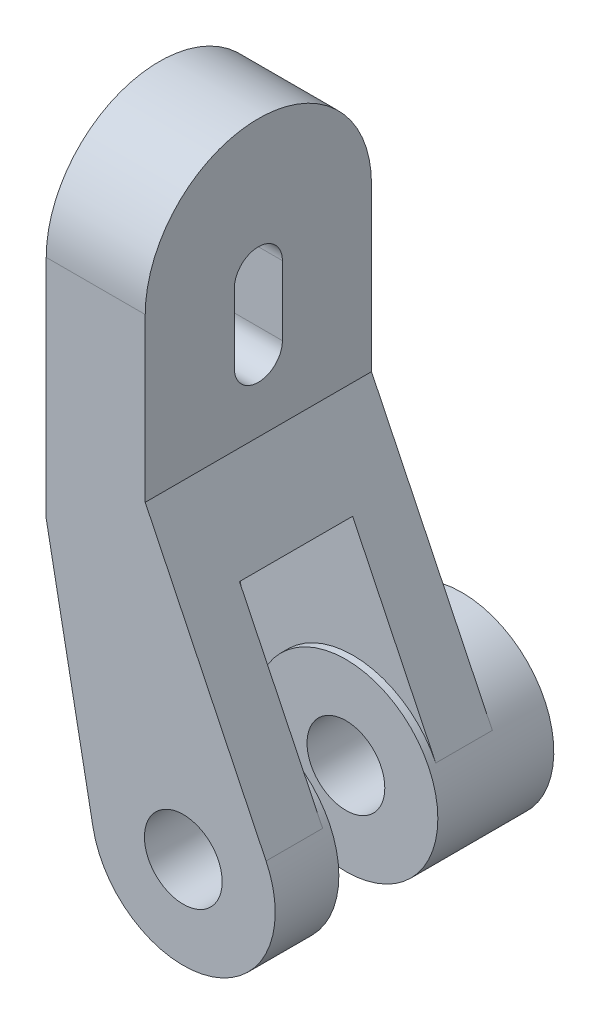
ISO-10303-21;
HEADER;
FILE_DESCRIPTION(('STEP AP214'),'2;1');
FILE_NAME('part.step','',(''),(''),'','','');
FILE_SCHEMA(('AUTOMOTIVE_DESIGN { 1 0 10303 214 1 1 1 1 }'));
ENDSEC;
DATA;
#1=APPLICATION_CONTEXT('core data for automotive mechanical design processes');
#2=APPLICATION_PROTOCOL_DEFINITION('international standard','automotive_design',2000,#1);
#3=PRODUCT_CONTEXT('',#1,'mechanical');
#4=PRODUCT('Part','Part','',(#3));
#5=PRODUCT_RELATED_PRODUCT_CATEGORY('part','',(#4));
#6=PRODUCT_DEFINITION_FORMATION('','',#4);
#7=PRODUCT_DEFINITION_CONTEXT('part definition',#1,'design');
#8=PRODUCT_DEFINITION('design','',#6,#7);
#9=PRODUCT_DEFINITION_SHAPE('','',#8);
#10=(LENGTH_UNIT() NAMED_UNIT(*) SI_UNIT(.MILLI.,.METRE.));
#11=(NAMED_UNIT(*) PLANE_ANGLE_UNIT() SI_UNIT($,.RADIAN.));
#12=(NAMED_UNIT(*) SI_UNIT($,.STERADIAN.) SOLID_ANGLE_UNIT());
#13=UNCERTAINTY_MEASURE_WITH_UNIT(LENGTH_MEASURE(1.E-05),#10,'distance_accuracy_value','');
#14=(GEOMETRIC_REPRESENTATION_CONTEXT(3) GLOBAL_UNCERTAINTY_ASSIGNED_CONTEXT((#13)) GLOBAL_UNIT_ASSIGNED_CONTEXT((#10,
#11,#12)) REPRESENTATION_CONTEXT('',''));
#15=CARTESIAN_POINT('',(0.,0.,0.));
#16=DIRECTION('',(0.,0.,1.));
#17=DIRECTION('',(1.,0.,0.));
#18=AXIS2_PLACEMENT_3D('',#15,#16,#17);
#19=CARTESIAN_POINT('',(7.,4.,-8.));
#20=DIRECTION('',(0.,0.,1.));
#21=DIRECTION('',(0.,-1.,0.));
#22=AXIS2_PLACEMENT_3D('',#19,#20,#21);
#23=PLANE('',#22);
#24=CARTESIAN_POINT('',(9.69154801995758,-28.0196444400174,-8.));
#25=DIRECTION('',(0.,0.,1.));
#26=DIRECTION('',(0.,-1.,0.));
#27=AXIS2_PLACEMENT_3D('',#24,#25,#26);
#28=CIRCLE('',#27,6.5);
#29=CARTESIAN_POINT('',(3.30794019699659,-29.2442060606111,-8.00000000000001));
#30=VERTEX_POINT('',#29);
#31=CARTESIAN_POINT('',(15.5447047577176,-25.1928872514328,-8.));
#32=VERTEX_POINT('',#31);
#33=EDGE_CURVE('E13',#30,#32,#28,.F.);
#34=ORIENTED_EDGE('',*,*,#33,.F.);
#35=DIRECTION('',(0.188394095475962,-0.982093511224768,0.));
#36=VECTOR('',#35,1.);
#37=CARTESIAN_POINT('',(3.30794019699659,-29.2442060606111,-8.));
#38=LINE('',#37,#36);
#39=CARTESIAN_POINT('',(0.,-12.,-8.));
#40=VERTEX_POINT('',#39);
#41=EDGE_CURVE('E356',#40,#30,#38,.T.);
#42=ORIENTED_EDGE('',*,*,#41,.F.);
#43=DIRECTION('',(0.,1.,0.));
#44=VECTOR('',#43,1.);
#45=CARTESIAN_POINT('',(0.,4.,-8.));
#46=LINE('',#45,#44);
#47=CARTESIAN_POINT('',(0.,4.,-8.));
#48=VERTEX_POINT('',#47);
#49=EDGE_CURVE('E415',#40,#48,#46,.T.);
#50=ORIENTED_EDGE('',*,*,#49,.T.);
#51=DIRECTION('',(-1.,0.,0.));
#52=VECTOR('',#51,1.);
#53=CARTESIAN_POINT('',(7.,4.,-8.));
#54=LINE('',#53,#52);
#55=CARTESIAN_POINT('',(7.,4.,-8.));
#56=VERTEX_POINT('',#55);
#57=EDGE_CURVE('E420',#56,#48,#54,.T.);
#58=ORIENTED_EDGE('',*,*,#57,.F.);
#59=DIRECTION('',(0.,1.,0.));
#60=VECTOR('',#59,1.);
#61=CARTESIAN_POINT('',(7.,4.,-8.));
#62=LINE('',#61,#60);
#63=CARTESIAN_POINT('',(7.,-7.5,-8.));
#64=VERTEX_POINT('',#63);
#65=EDGE_CURVE('E418',#64,#56,#62,.T.);
#66=ORIENTED_EDGE('',*,*,#65,.F.);
#67=DIRECTION('',(-0.434885721320709,0.900485651963077,0.));
#68=VECTOR('',#67,1.);
#69=CARTESIAN_POINT('',(15.5447047577176,-25.1928872514328,-8.));
#70=LINE('',#69,#68);
#71=EDGE_CURVE('E359',#32,#64,#70,.T.);
#72=ORIENTED_EDGE('',*,*,#71,.F.);
#73=EDGE_LOOP('',(#34,#42,#50,#58,#66,#72));
#74=FACE_BOUND('',#73,.T.);
#75=ADVANCED_FACE('F129',(#74),#23,.F.);
#76=CARTESIAN_POINT('',(9.69154801995758,-28.0196444400174,4.));
#77=DIRECTION('',(0.,0.,1.));
#78=DIRECTION('',(1.,0.,0.));
#79=AXIS2_PLACEMENT_3D('',#76,#77,#78);
#80=PLANE('',#79);
#81=CARTESIAN_POINT('',(9.69154801995758,-28.0196444400174,4.));
#82=DIRECTION('',(0.,0.,1.));
#83=DIRECTION('',(1.,0.,0.));
#84=AXIS2_PLACEMENT_3D('',#81,#82,#83);
#85=CIRCLE('',#84,6.5);
#86=CARTESIAN_POINT('',(3.30794019699659,-29.2442060606111,4.));
#87=VERTEX_POINT('',#86);
#88=CARTESIAN_POINT('',(15.5447047577176,-25.1928872514328,4.));
#89=VERTEX_POINT('',#88);
#90=EDGE_CURVE('E439',#87,#89,#85,.F.);
#91=ORIENTED_EDGE('',*,*,#90,.F.);
#92=DIRECTION('',(-0.188394095475962,0.982093511224768,0.));
#93=VECTOR('',#92,1.);
#94=CARTESIAN_POINT('',(3.30794019699659,-29.2442060606111,4.));
#95=LINE('',#94,#93);
#96=CARTESIAN_POINT('',(0.761133518101404,-15.9677691990004,4.));
#97=VERTEX_POINT('',#96);
#98=EDGE_CURVE('E432',#87,#97,#95,.T.);
#99=ORIENTED_EDGE('',*,*,#98,.T.);
#100=CARTESIAN_POINT('',(9.69154801995758,-28.0196444400174,4.));
#101=DIRECTION('',(0.,0.,1.));
#102=DIRECTION('',(1.,0.,0.));
#103=AXIS2_PLACEMENT_3D('',#100,#101,#102);
#104=CIRCLE('',#103,15.);
#105=CARTESIAN_POINT('',(9.66569959666118,-13.0196667114001,4.));
#106=VERTEX_POINT('',#105);
#107=EDGE_CURVE('E342',#106,#97,#104,.T.);
#108=ORIENTED_EDGE('',*,*,#107,.F.);
#109=DIRECTION('',(0.434885721320709,-0.900485651963077,0.));
#110=VECTOR('',#109,1.);
#111=CARTESIAN_POINT('',(15.5447047577176,-25.1928872514328,4.));
#112=LINE('',#111,#110);
#113=EDGE_CURVE('E346',#106,#89,#112,.T.);
#114=ORIENTED_EDGE('',*,*,#113,.T.);
#115=EDGE_LOOP('',(#91,#99,#108,#114));
#116=FACE_BOUND('',#115,.T.);
#117=ADVANCED_FACE('F486',(#116),#80,.F.);
#118=CARTESIAN_POINT('',(15.5447047577176,-25.1928872514328,-8.));
#119=DIRECTION('',(0.900485651963076,0.434885721320709,0.));
#120=DIRECTION('',(-0.434885721320709,0.900485651963077,0.));
#121=AXIS2_PLACEMENT_3D('',#118,#119,#120);
#122=PLANE('',#121);
#123=DIRECTION('',(0.,0.,1.));
#124=VECTOR('',#123,1.);
#125=CARTESIAN_POINT('',(9.66569959666118,-13.0196667114001,-4.));
#126=LINE('',#125,#124);
#127=CARTESIAN_POINT('',(9.66569959666118,-13.0196667114001,-4.));
#128=VERTEX_POINT('',#127);
#129=EDGE_CURVE('E353',#128,#106,#126,.T.);
#130=ORIENTED_EDGE('',*,*,#129,.F.);
#131=DIRECTION('',(0.434885721320709,-0.900485651963077,0.));
#132=VECTOR('',#131,1.);
#133=CARTESIAN_POINT('',(15.5447047577176,-25.1928872514328,-4.));
#134=LINE('',#133,#132);
#135=CARTESIAN_POINT('',(15.5447047577176,-25.1928872514328,-4.));
#136=VERTEX_POINT('',#135);
#137=EDGE_CURVE('E350',#128,#136,#134,.T.);
#138=ORIENTED_EDGE('',*,*,#137,.T.);
#139=DIRECTION('',(0.,0.,1.));
#140=VECTOR('',#139,1.);
#141=CARTESIAN_POINT('',(15.5447047577176,-25.1928872514328,-8.));
#142=LINE('',#141,#140);
#143=EDGE_CURVE('E373',#32,#136,#142,.T.);
#144=ORIENTED_EDGE('',*,*,#143,.F.);
#145=ORIENTED_EDGE('',*,*,#71,.T.);
#146=DIRECTION('',(0.,0.,1.));
#147=VECTOR('',#146,1.);
#148=CARTESIAN_POINT('',(7.,-7.5,-8.));
#149=LINE('',#148,#147);
#150=CARTESIAN_POINT('',(7.,-7.5,8.));
#151=VERTEX_POINT('',#150);
#152=EDGE_CURVE('E370',#64,#151,#149,.T.);
#153=ORIENTED_EDGE('',*,*,#152,.T.);
#154=DIRECTION('',(-0.434885721320709,0.900485651963077,0.));
#155=VECTOR('',#154,1.);
#156=CARTESIAN_POINT('',(15.5447047577176,-25.1928872514328,8.));
#157=LINE('',#156,#155);
#158=CARTESIAN_POINT('',(15.5447047577176,-25.1928872514328,8.));
#159=VERTEX_POINT('',#158);
#160=EDGE_CURVE('E360',#159,#151,#157,.T.);
#161=ORIENTED_EDGE('',*,*,#160,.F.);
#162=EDGE_CURVE('E376',#89,#159,#142,.T.);
#163=ORIENTED_EDGE('',*,*,#162,.F.);
#164=ORIENTED_EDGE('',*,*,#113,.F.);
#165=EDGE_LOOP('',(#130,#138,#144,#145,#153,#161,#163,#164));
#166=FACE_BOUND('',#165,.T.);
#167=ADVANCED_FACE('F473',(#166),#122,.T.);
#168=CARTESIAN_POINT('',(9.69154801995758,-28.0196444400174,-8.));
#169=DIRECTION('',(0.,0.,1.));
#170=DIRECTION('',(1.,0.,0.));
#171=AXIS2_PLACEMENT_3D('',#168,#169,#170);
#172=CYLINDRICAL_SURFACE('',#171,6.5);
#173=ORIENTED_EDGE('',*,*,#143,.T.);
#174=CARTESIAN_POINT('',(9.69154801995758,-28.0196444400174,-4.));
#175=DIRECTION('',(0.,0.,1.));
#176=DIRECTION('',(1.,0.,0.));
#177=AXIS2_PLACEMENT_3D('',#174,#175,#176);
#178=CIRCLE('',#177,6.5);
#179=CARTESIAN_POINT('',(3.3079401969966,-29.2442060606111,-4.));
#180=VERTEX_POINT('',#179);
#181=EDGE_CURVE('E137',#136,#180,#178,.T.);
#182=ORIENTED_EDGE('',*,*,#181,.T.);
#183=DIRECTION('',(0.,0.,1.));
#184=VECTOR('',#183,1.);
#185=CARTESIAN_POINT('',(3.30794019699659,-29.2442060606111,-8.));
#186=LINE('',#185,#184);
#187=EDGE_CURVE('E377',#30,#180,#186,.T.);
#188=ORIENTED_EDGE('',*,*,#187,.F.);
#189=ORIENTED_EDGE('',*,*,#33,.T.);
#190=EDGE_LOOP('',(#173,#182,#188,#189));
#191=FACE_BOUND('',#190,.T.);
#192=CARTESIAN_POINT('',(9.69154801995758,-28.0196444400174,-3.5));
#193=DIRECTION('',(0.,0.,-1.));
#194=DIRECTION('',(-1.,0.,0.));
#195=AXIS2_PLACEMENT_3D('',#192,#193,#194);
#196=CIRCLE('',#195,6.5);
#197=CARTESIAN_POINT('',(3.19154801995759,-28.0196444400174,-3.5));
#198=VERTEX_POINT('',#197);
#199=EDGE_CURVE('E336',#198,#198,#196,.T.);
#200=ORIENTED_EDGE('',*,*,#199,.T.);
#201=EDGE_LOOP('',(#200));
#202=FACE_BOUND('',#201,.T.);
#203=CARTESIAN_POINT('',(9.69154801995758,-28.0196444400174,-11.7));
#204=DIRECTION('',(0.,0.,-1.));
#205=DIRECTION('',(0.,1.,0.));
#206=AXIS2_PLACEMENT_3D('',#203,#204,#205);
#207=CIRCLE('',#206,6.5);
#208=CARTESIAN_POINT('',(9.69154801995758,-21.5196444400174,-11.7));
#209=VERTEX_POINT('',#208);
#210=EDGE_CURVE('E283',#209,#209,#207,.T.);
#211=ORIENTED_EDGE('',*,*,#210,.F.);
#212=EDGE_LOOP('',(#211));
#213=FACE_BOUND('',#212,.T.);
#214=ADVANCED_FACE('F444',(#191,#202,#213),#172,.T.);
#215=CARTESIAN_POINT('',(3.30794019699659,-29.2442060606111,-8.));
#216=DIRECTION('',(-0.982093511224768,-0.188394095475962,0.));
#217=DIRECTION('',(0.188394095475962,-0.982093511224768,0.));
#218=AXIS2_PLACEMENT_3D('',#215,#216,#217);
#219=PLANE('',#218);
#220=ORIENTED_EDGE('',*,*,#187,.T.);
#221=DIRECTION('',(-0.188394095475962,0.982093511224768,0.));
#222=VECTOR('',#221,1.);
#223=CARTESIAN_POINT('',(3.30794019699659,-29.2442060606111,-4.));
#224=LINE('',#223,#222);
#225=CARTESIAN_POINT('',(0.761133518101404,-15.9677691990004,-4.));
#226=VERTEX_POINT('',#225);
#227=EDGE_CURVE('E436',#180,#226,#224,.T.);
#228=ORIENTED_EDGE('',*,*,#227,.T.);
#229=DIRECTION('',(0.,0.,1.));
#230=VECTOR('',#229,1.);
#231=CARTESIAN_POINT('',(0.761133518101404,-15.9677691990004,-4.));
#232=LINE('',#231,#230);
#233=EDGE_CURVE('E434',#97,#226,#232,.F.);
#234=ORIENTED_EDGE('',*,*,#233,.F.);
#235=ORIENTED_EDGE('',*,*,#98,.F.);
#236=CARTESIAN_POINT('',(3.30794019699659,-29.2442060606111,8.));
#237=VERTEX_POINT('',#236);
#238=EDGE_CURVE('E362',#87,#237,#186,.T.);
#239=ORIENTED_EDGE('',*,*,#238,.T.);
#240=DIRECTION('',(0.188394095475962,-0.982093511224768,0.));
#241=VECTOR('',#240,1.);
#242=CARTESIAN_POINT('',(3.30794019699659,-29.2442060606111,8.));
#243=LINE('',#242,#241);
#244=CARTESIAN_POINT('',(0.,-12.,8.));
#245=VERTEX_POINT('',#244);
#246=EDGE_CURVE('E355',#245,#237,#243,.T.);
#247=ORIENTED_EDGE('',*,*,#246,.F.);
#248=DIRECTION('',(0.,0.,-1.));
#249=VECTOR('',#248,1.);
#250=CARTESIAN_POINT('',(0.,-12.,0.));
#251=LINE('',#250,#249);
#252=EDGE_CURVE('E372',#245,#40,#251,.T.);
#253=ORIENTED_EDGE('',*,*,#252,.T.);
#254=ORIENTED_EDGE('',*,*,#41,.T.);
#255=EDGE_LOOP('',(#220,#228,#234,#235,#239,#247,#253,#254));
#256=FACE_BOUND('',#255,.T.);
#257=ADVANCED_FACE('F452',(#256),#219,.T.);
#258=CARTESIAN_POINT('',(7.,4.,0.));
#259=DIRECTION('',(-1.,0.,0.));
#260=DIRECTION('',(0.,0.,1.));
#261=AXIS2_PLACEMENT_3D('',#258,#259,#260);
#262=CYLINDRICAL_SURFACE('',#261,8.);
#263=CARTESIAN_POINT('',(0.,4.,0.));
#264=DIRECTION('',(1.,0.,0.));
#265=DIRECTION('',(0.,0.,-1.));
#266=AXIS2_PLACEMENT_3D('',#263,#264,#265);
#267=CIRCLE('',#266,8.);
#268=CARTESIAN_POINT('',(0.,4.,8.));
#269=VERTEX_POINT('',#268);
#270=EDGE_CURVE('E410',#48,#269,#267,.T.);
#271=ORIENTED_EDGE('',*,*,#270,.T.);
#272=DIRECTION('',(-1.,0.,0.));
#273=VECTOR('',#272,1.);
#274=CARTESIAN_POINT('',(7.,4.,8.));
#275=LINE('',#274,#273);
#276=CARTESIAN_POINT('',(7.,4.,8.));
#277=VERTEX_POINT('',#276);
#278=EDGE_CURVE('E429',#277,#269,#275,.T.);
#279=ORIENTED_EDGE('',*,*,#278,.F.);
#280=CARTESIAN_POINT('',(7.,4.,0.));
#281=DIRECTION('',(1.,0.,0.));
#282=DIRECTION('',(0.,0.,-1.));
#283=AXIS2_PLACEMENT_3D('',#280,#281,#282);
#284=CIRCLE('',#283,8.);
#285=EDGE_CURVE('E411',#56,#277,#284,.T.);
#286=ORIENTED_EDGE('',*,*,#285,.F.);
#287=ORIENTED_EDGE('',*,*,#57,.T.);
#288=EDGE_LOOP('',(#271,#279,#286,#287));
#289=FACE_BOUND('',#288,.T.);
#290=ADVANCED_FACE('F131',(#289),#262,.T.);
#291=CARTESIAN_POINT('',(7.,4.,8.));
#292=DIRECTION('',(0.,0.,-1.));
#293=DIRECTION('',(0.,1.,0.));
#294=AXIS2_PLACEMENT_3D('',#291,#292,#293);
#295=PLANE('',#294);
#296=CARTESIAN_POINT('',(9.69154801995758,-28.0196444400174,8.));
#297=DIRECTION('',(0.,0.,1.));
#298=DIRECTION('',(1.,0.,0.));
#299=AXIS2_PLACEMENT_3D('',#296,#297,#298);
#300=CIRCLE('',#299,2.74999999999999);
#301=CARTESIAN_POINT('',(12.4415480199576,-28.0196444400174,8.));
#302=VERTEX_POINT('',#301);
#303=EDGE_CURVE('E324',#302,#302,#300,.T.);
#304=ORIENTED_EDGE('',*,*,#303,.F.);
#305=EDGE_LOOP('',(#304));
#306=FACE_BOUND('',#305,.T.);
#307=DIRECTION('',(0.,-1.,0.));
#308=VECTOR('',#307,1.);
#309=CARTESIAN_POINT('',(0.,4.,8.));
#310=LINE('',#309,#308);
#311=EDGE_CURVE('E423',#269,#245,#310,.T.);
#312=ORIENTED_EDGE('',*,*,#311,.T.);
#313=ORIENTED_EDGE('',*,*,#246,.T.);
#314=CARTESIAN_POINT('',(9.69154801995758,-28.0196444400174,8.));
#315=DIRECTION('',(0.,0.,1.));
#316=DIRECTION('',(1.,0.,0.));
#317=AXIS2_PLACEMENT_3D('',#314,#315,#316);
#318=CIRCLE('',#317,6.5);
#319=EDGE_CURVE('E365',#237,#159,#318,.T.);
#320=ORIENTED_EDGE('',*,*,#319,.T.);
#321=ORIENTED_EDGE('',*,*,#160,.T.);
#322=DIRECTION('',(0.,-1.,0.));
#323=VECTOR('',#322,1.);
#324=CARTESIAN_POINT('',(7.,4.,8.));
#325=LINE('',#324,#323);
#326=EDGE_CURVE('E414',#277,#151,#325,.T.);
#327=ORIENTED_EDGE('',*,*,#326,.F.);
#328=ORIENTED_EDGE('',*,*,#278,.T.);
#329=EDGE_LOOP('',(#312,#313,#320,#321,#327,#328));
#330=FACE_BOUND('',#329,.T.);
#331=ADVANCED_FACE('F476',(#306,#330),#295,.F.);
#332=DIRECTION('',(-1.,0.,0.));
#333=VECTOR('',#332,1.);
#334=CARTESIAN_POINT('',(12.2030216909325,-32.3696444400174,-8.00000000000001));
#335=LINE('',#334,#333);
#336=CARTESIAN_POINT('',(12.2030216909325,-32.3696444400174,-8.00000000000001));
#337=VERTEX_POINT('',#336);
#338=CARTESIAN_POINT('',(7.18007434898271,-32.3696444400174,-8.00000000000001));
#339=VERTEX_POINT('',#338);
#340=EDGE_CURVE('E276',#337,#339,#335,.T.);
#341=ORIENTED_EDGE('',*,*,#340,.T.);
#342=DIRECTION('',(-0.5,0.866025403784439,0.));
#343=VECTOR('',#342,1.);
#344=CARTESIAN_POINT('',(7.18007434898271,-32.3696444400174,-8.00000000000001));
#345=LINE('',#344,#343);
#346=CARTESIAN_POINT('',(4.66860067800784,-28.0196444400174,-8.00000000000001));
#347=VERTEX_POINT('',#346);
#348=EDGE_CURVE('E300',#339,#347,#345,.T.);
#349=ORIENTED_EDGE('',*,*,#348,.T.);
#350=DIRECTION('',(0.5,0.866025403784438,0.));
#351=VECTOR('',#350,1.);
#352=CARTESIAN_POINT('',(4.66860067800784,-28.0196444400174,-8.00000000000001));
#353=LINE('',#352,#351);
#354=CARTESIAN_POINT('',(7.18007434898271,-23.6696444400174,-8.00000000000001));
#355=VERTEX_POINT('',#354);
#356=EDGE_CURVE('E282',#347,#355,#353,.T.);
#357=ORIENTED_EDGE('',*,*,#356,.T.);
#358=DIRECTION('',(1.,0.,0.));
#359=VECTOR('',#358,1.);
#360=CARTESIAN_POINT('',(7.18007434898271,-23.6696444400174,-8.00000000000001));
#361=LINE('',#360,#359);
#362=CARTESIAN_POINT('',(12.2030216909325,-23.6696444400174,-8.00000000000001));
#363=VERTEX_POINT('',#362);
#364=EDGE_CURVE('E303',#355,#363,#361,.T.);
#365=ORIENTED_EDGE('',*,*,#364,.T.);
#366=DIRECTION('',(0.5,-0.866025403784439,0.));
#367=VECTOR('',#366,1.);
#368=CARTESIAN_POINT('',(12.2030216909325,-23.6696444400174,-8.00000000000001));
#369=LINE('',#368,#367);
#370=CARTESIAN_POINT('',(14.7144953619073,-28.0196444400174,-8.00000000000001));
#371=VERTEX_POINT('',#370);
#372=EDGE_CURVE('E306',#363,#371,#369,.T.);
#373=ORIENTED_EDGE('',*,*,#372,.T.);
#374=DIRECTION('',(-0.5,-0.866025403784439,0.));
#375=VECTOR('',#374,1.);
#376=CARTESIAN_POINT('',(14.7144953619073,-28.0196444400174,-8.00000000000001));
#377=LINE('',#376,#375);
#378=EDGE_CURVE('E309',#371,#337,#377,.T.);
#379=ORIENTED_EDGE('',*,*,#378,.T.);
#380=EDGE_LOOP('',(#341,#349,#357,#365,#373,#379));
#381=FACE_BOUND('',#380,.T.);
#382=CARTESIAN_POINT('',(9.69154801995758,-28.0196444400174,-8.));
#383=DIRECTION('',(0.,0.,1.));
#384=DIRECTION('',(1.,0.,0.));
#385=AXIS2_PLACEMENT_3D('',#382,#383,#384);
#386=CIRCLE('',#385,2.75);
#387=CARTESIAN_POINT('',(12.4415480199576,-28.0196444400174,-8.));
#388=VERTEX_POINT('',#387);
#389=EDGE_CURVE('E327',#388,#388,#386,.T.);
#390=ORIENTED_EDGE('',*,*,#389,.T.);
#391=EDGE_LOOP('',(#390));
#392=FACE_BOUND('',#391,.T.);
#393=ADVANCED_FACE('F503',(#381,#392),#23,.F.);
#394=CARTESIAN_POINT('',(7.,4.,0.));
#395=DIRECTION('',(1.,0.,0.));
#396=DIRECTION('',(0.,0.,-1.));
#397=AXIS2_PLACEMENT_3D('',#394,#395,#396);
#398=PLANE('',#397);
#399=ORIENTED_EDGE('',*,*,#152,.F.);
#400=ORIENTED_EDGE('',*,*,#65,.T.);
#401=ORIENTED_EDGE('',*,*,#285,.T.);
#402=ORIENTED_EDGE('',*,*,#326,.T.);
#403=EDGE_LOOP('',(#399,#400,#401,#402));
#404=FACE_BOUND('',#403,.T.);
#405=CARTESIAN_POINT('',(7.,2.45,0.));
#406=DIRECTION('',(1.,0.,0.));
#407=DIRECTION('',(0.,0.,-1.));
#408=AXIS2_PLACEMENT_3D('',#405,#406,#407);
#409=CIRCLE('',#408,1.69999999999999);
#410=CARTESIAN_POINT('',(7.,2.45,-1.70000000000003));
#411=VERTEX_POINT('',#410);
#412=CARTESIAN_POINT('',(7.,2.45,1.69999999999999));
#413=VERTEX_POINT('',#412);
#414=EDGE_CURVE('E399',#411,#413,#409,.T.);
#415=ORIENTED_EDGE('',*,*,#414,.F.);
#416=DIRECTION('',(0.,1.,0.));
#417=VECTOR('',#416,1.);
#418=CARTESIAN_POINT('',(7.,-2.45,-1.70000000000004));
#419=LINE('',#418,#417);
#420=CARTESIAN_POINT('',(7.,-2.45,-1.69999999999999));
#421=VERTEX_POINT('',#420);
#422=EDGE_CURVE('E381',#421,#411,#419,.T.);
#423=ORIENTED_EDGE('',*,*,#422,.F.);
#424=CARTESIAN_POINT('',(7.,-2.45,0.));
#425=DIRECTION('',(1.,0.,0.));
#426=DIRECTION('',(0.,0.,-1.));
#427=AXIS2_PLACEMENT_3D('',#424,#425,#426);
#428=CIRCLE('',#427,1.69999999999999);
#429=CARTESIAN_POINT('',(7.,-2.45,1.69999999999999));
#430=VERTEX_POINT('',#429);
#431=EDGE_CURVE('E391',#430,#421,#428,.T.);
#432=ORIENTED_EDGE('',*,*,#431,.F.);
#433=DIRECTION('',(0.,1.,0.));
#434=VECTOR('',#433,1.);
#435=CARTESIAN_POINT('',(7.,-2.45,1.69999999999999));
#436=LINE('',#435,#434);
#437=EDGE_CURVE('E388',#430,#413,#436,.T.);
#438=ORIENTED_EDGE('',*,*,#437,.T.);
#439=EDGE_LOOP('',(#415,#423,#432,#438));
#440=FACE_BOUND('',#439,.T.);
#441=ADVANCED_FACE('F468',(#404,#440),#398,.T.);
#442=CARTESIAN_POINT('',(0.,4.,0.));
#443=DIRECTION('',(1.,0.,0.));
#444=DIRECTION('',(0.,0.,-1.));
#445=AXIS2_PLACEMENT_3D('',#442,#443,#444);
#446=PLANE('',#445);
#447=DIRECTION('',(0.,1.,0.));
#448=VECTOR('',#447,1.);
#449=CARTESIAN_POINT('',(0.,-2.45,-1.7));
#450=LINE('',#449,#448);
#451=CARTESIAN_POINT('',(0.,-2.45,-1.7));
#452=VERTEX_POINT('',#451);
#453=CARTESIAN_POINT('',(0.,2.45,-1.7));
#454=VERTEX_POINT('',#453);
#455=EDGE_CURVE('E383',#452,#454,#450,.T.);
#456=ORIENTED_EDGE('',*,*,#455,.T.);
#457=CARTESIAN_POINT('',(0.,2.45,0.));
#458=DIRECTION('',(1.,0.,0.));
#459=DIRECTION('',(0.,0.,-1.));
#460=AXIS2_PLACEMENT_3D('',#457,#458,#459);
#461=CIRCLE('',#460,1.7);
#462=CARTESIAN_POINT('',(0.,2.45,1.69999999999999));
#463=VERTEX_POINT('',#462);
#464=EDGE_CURVE('E402',#454,#463,#461,.T.);
#465=ORIENTED_EDGE('',*,*,#464,.T.);
#466=DIRECTION('',(0.,1.,0.));
#467=VECTOR('',#466,1.);
#468=CARTESIAN_POINT('',(0.,-2.45,1.69999999999999));
#469=LINE('',#468,#467);
#470=CARTESIAN_POINT('',(0.,-2.45,1.69999999999999));
#471=VERTEX_POINT('',#470);
#472=EDGE_CURVE('E386',#471,#463,#469,.T.);
#473=ORIENTED_EDGE('',*,*,#472,.F.);
#474=CARTESIAN_POINT('',(0.,-2.45,0.));
#475=DIRECTION('',(1.,0.,0.));
#476=DIRECTION('',(0.,0.,-1.));
#477=AXIS2_PLACEMENT_3D('',#474,#475,#476);
#478=CIRCLE('',#477,1.7);
#479=EDGE_CURVE('E152',#471,#452,#478,.T.);
#480=ORIENTED_EDGE('',*,*,#479,.T.);
#481=EDGE_LOOP('',(#456,#465,#473,#480));
#482=FACE_BOUND('',#481,.T.);
#483=ORIENTED_EDGE('',*,*,#270,.F.);
#484=ORIENTED_EDGE('',*,*,#49,.F.);
#485=ORIENTED_EDGE('',*,*,#252,.F.);
#486=ORIENTED_EDGE('',*,*,#311,.F.);
#487=EDGE_LOOP('',(#483,#484,#485,#486));
#488=FACE_BOUND('',#487,.T.);
#489=ADVANCED_FACE('F461',(#482,#488),#446,.F.);
#490=CARTESIAN_POINT('',(7.,2.45,0.));
#491=DIRECTION('',(1.,0.,0.));
#492=DIRECTION('',(0.,0.,-1.));
#493=AXIS2_PLACEMENT_3D('',#490,#491,#492);
#494=CYLINDRICAL_SURFACE('',#493,1.69999999999999);
#495=ORIENTED_EDGE('',*,*,#464,.F.);
#496=DIRECTION('',(1.,0.,0.));
#497=VECTOR('',#496,1.);
#498=CARTESIAN_POINT('',(7.,2.45,-1.69999999999999));
#499=LINE('',#498,#497);
#500=EDGE_CURVE('E407',#411,#454,#499,.F.);
#501=ORIENTED_EDGE('',*,*,#500,.F.);
#502=ORIENTED_EDGE('',*,*,#414,.T.);
#503=DIRECTION('',(1.,0.,0.));
#504=VECTOR('',#503,1.);
#505=CARTESIAN_POINT('',(7.,2.45,1.69999999999999));
#506=LINE('',#505,#504);
#507=EDGE_CURVE('E405',#463,#413,#506,.T.);
#508=ORIENTED_EDGE('',*,*,#507,.F.);
#509=EDGE_LOOP('',(#495,#501,#502,#508));
#510=FACE_BOUND('',#509,.T.);
#511=ADVANCED_FACE('F711',(#510),#494,.F.);
#512=CARTESIAN_POINT('',(7.,-2.45,0.));
#513=DIRECTION('',(1.,0.,0.));
#514=DIRECTION('',(0.,0.,-1.));
#515=AXIS2_PLACEMENT_3D('',#512,#513,#514);
#516=CYLINDRICAL_SURFACE('',#515,1.69999999999999);
#517=ORIENTED_EDGE('',*,*,#431,.T.);
#518=DIRECTION('',(1.,0.,0.));
#519=VECTOR('',#518,1.);
#520=CARTESIAN_POINT('',(7.,-2.45,-1.69999999999999));
#521=LINE('',#520,#519);
#522=EDGE_CURVE('E395',#452,#421,#521,.T.);
#523=ORIENTED_EDGE('',*,*,#522,.F.);
#524=ORIENTED_EDGE('',*,*,#479,.F.);
#525=DIRECTION('',(1.,0.,0.));
#526=VECTOR('',#525,1.);
#527=CARTESIAN_POINT('',(7.,-2.45,1.69999999999999));
#528=LINE('',#527,#526);
#529=EDGE_CURVE('E397',#430,#471,#528,.F.);
#530=ORIENTED_EDGE('',*,*,#529,.F.);
#531=EDGE_LOOP('',(#517,#523,#524,#530));
#532=FACE_BOUND('',#531,.T.);
#533=ADVANCED_FACE('F738',(#532),#516,.F.);
#534=CARTESIAN_POINT('',(7.,-2.45,1.69999999999999));
#535=DIRECTION('',(0.,0.,1.));
#536=DIRECTION('',(0.,-1.,0.));
#537=AXIS2_PLACEMENT_3D('',#534,#535,#536);
#538=PLANE('',#537);
#539=ORIENTED_EDGE('',*,*,#507,.T.);
#540=ORIENTED_EDGE('',*,*,#437,.F.);
#541=ORIENTED_EDGE('',*,*,#529,.T.);
#542=ORIENTED_EDGE('',*,*,#472,.T.);
#543=EDGE_LOOP('',(#539,#540,#541,#542));
#544=FACE_BOUND('',#543,.T.);
#545=ADVANCED_FACE('F728',(#544),#538,.F.);
#546=CARTESIAN_POINT('',(7.,-2.45,-1.69999999999999));
#547=DIRECTION('',(0.,0.,-1.));
#548=DIRECTION('',(0.,1.,0.));
#549=AXIS2_PLACEMENT_3D('',#546,#547,#548);
#550=PLANE('',#549);
#551=ORIENTED_EDGE('',*,*,#500,.T.);
#552=ORIENTED_EDGE('',*,*,#455,.F.);
#553=ORIENTED_EDGE('',*,*,#522,.T.);
#554=ORIENTED_EDGE('',*,*,#422,.T.);
#555=EDGE_LOOP('',(#551,#552,#553,#554));
#556=FACE_BOUND('',#555,.T.);
#557=ADVANCED_FACE('F497',(#556),#550,.F.);
#558=ORIENTED_EDGE('',*,*,#238,.F.);
#559=ORIENTED_EDGE('',*,*,#90,.T.);
#560=ORIENTED_EDGE('',*,*,#162,.T.);
#561=ORIENTED_EDGE('',*,*,#319,.F.);
#562=EDGE_LOOP('',(#558,#559,#560,#561));
#563=FACE_BOUND('',#562,.T.);
#564=CARTESIAN_POINT('',(9.69154801995758,-28.0196444400174,3.5));
#565=DIRECTION('',(0.,0.,-1.));
#566=DIRECTION('',(-1.,0.,0.));
#567=AXIS2_PLACEMENT_3D('',#564,#565,#566);
#568=CIRCLE('',#567,6.5);
#569=CARTESIAN_POINT('',(3.19154801995759,-28.0196444400174,3.5));
#570=VERTEX_POINT('',#569);
#571=EDGE_CURVE('E339',#570,#570,#568,.T.);
#572=ORIENTED_EDGE('',*,*,#571,.F.);
#573=EDGE_LOOP('',(#572));
#574=FACE_BOUND('',#573,.T.);
#575=ADVANCED_FACE('F479',(#563,#574),#172,.T.);
#576=CARTESIAN_POINT('',(9.69154801995758,-28.0196444400174,-4.));
#577=DIRECTION('',(0.,0.,1.));
#578=DIRECTION('',(1.,0.,0.));
#579=AXIS2_PLACEMENT_3D('',#576,#577,#578);
#580=CYLINDRICAL_SURFACE('',#579,15.);
#581=ORIENTED_EDGE('',*,*,#129,.T.);
#582=ORIENTED_EDGE('',*,*,#107,.T.);
#583=ORIENTED_EDGE('',*,*,#233,.T.);
#584=CARTESIAN_POINT('',(9.69154801995758,-28.0196444400174,-4.));
#585=DIRECTION('',(0.,0.,1.));
#586=DIRECTION('',(1.,0.,0.));
#587=AXIS2_PLACEMENT_3D('',#584,#585,#586);
#588=CIRCLE('',#587,15.);
#589=EDGE_CURVE('E343',#128,#226,#588,.T.);
#590=ORIENTED_EDGE('',*,*,#589,.F.);
#591=EDGE_LOOP('',(#581,#582,#583,#590));
#592=FACE_BOUND('',#591,.T.);
#593=ADVANCED_FACE('F488',(#592),#580,.F.);
#594=CARTESIAN_POINT('',(9.69154801995758,-28.0196444400174,-4.));
#595=DIRECTION('',(0.,0.,1.));
#596=DIRECTION('',(1.,0.,0.));
#597=AXIS2_PLACEMENT_3D('',#594,#595,#596);
#598=PLANE('',#597);
#599=ORIENTED_EDGE('',*,*,#181,.F.);
#600=ORIENTED_EDGE('',*,*,#137,.F.);
#601=ORIENTED_EDGE('',*,*,#589,.T.);
#602=ORIENTED_EDGE('',*,*,#227,.F.);
#603=EDGE_LOOP('',(#599,#600,#601,#602));
#604=FACE_BOUND('',#603,.T.);
#605=ADVANCED_FACE('F448',(#604),#598,.T.);
#606=CARTESIAN_POINT('',(9.69154801995758,-28.0196444400174,3.5));
#607=DIRECTION('',(0.,0.,-1.));
#608=DIRECTION('',(-1.,0.,0.));
#609=AXIS2_PLACEMENT_3D('',#606,#607,#608);
#610=PLANE('',#609);
#611=CARTESIAN_POINT('',(9.69154801995758,-28.0196444400174,3.5));
#612=DIRECTION('',(0.,0.,-1.));
#613=DIRECTION('',(-1.,0.,0.));
#614=AXIS2_PLACEMENT_3D('',#611,#612,#613);
#615=CIRCLE('',#614,2.74999999999999);
#616=CARTESIAN_POINT('',(6.94154801995759,-28.0196444400174,3.5));
#617=VERTEX_POINT('',#616);
#618=EDGE_CURVE('E330',#617,#617,#615,.T.);
#619=ORIENTED_EDGE('',*,*,#618,.F.);
#620=EDGE_LOOP('',(#619));
#621=FACE_BOUND('',#620,.T.);
#622=ORIENTED_EDGE('',*,*,#571,.T.);
#623=EDGE_LOOP('',(#622));
#624=FACE_BOUND('',#623,.T.);
#625=ADVANCED_FACE('F495',(#621,#624),#610,.T.);
#626=CARTESIAN_POINT('',(9.69154801995758,-28.0196444400174,-3.5));
#627=DIRECTION('',(0.,0.,1.));
#628=DIRECTION('',(-1.,0.,0.));
#629=AXIS2_PLACEMENT_3D('',#626,#627,#628);
#630=PLANE('',#629);
#631=CARTESIAN_POINT('',(9.69154801995758,-28.0196444400174,-3.5));
#632=DIRECTION('',(0.,0.,1.));
#633=DIRECTION('',(1.,0.,0.));
#634=AXIS2_PLACEMENT_3D('',#631,#632,#633);
#635=CIRCLE('',#634,2.74999999999999);
#636=CARTESIAN_POINT('',(12.4415480199576,-28.0196444400174,-3.5));
#637=VERTEX_POINT('',#636);
#638=EDGE_CURVE('E333',#637,#637,#635,.T.);
#639=ORIENTED_EDGE('',*,*,#638,.F.);
#640=EDGE_LOOP('',(#639));
#641=FACE_BOUND('',#640,.T.);
#642=ORIENTED_EDGE('',*,*,#199,.F.);
#643=EDGE_LOOP('',(#642));
#644=FACE_BOUND('',#643,.T.);
#645=ADVANCED_FACE('F522',(#641,#644),#630,.T.);
#646=CARTESIAN_POINT('',(9.69154801995758,-28.0196444400174,8.));
#647=DIRECTION('',(0.,0.,1.));
#648=DIRECTION('',(1.,0.,0.));
#649=AXIS2_PLACEMENT_3D('',#646,#647,#648);
#650=CYLINDRICAL_SURFACE('',#649,2.74999999999999);
#651=ORIENTED_EDGE('',*,*,#638,.T.);
#652=EDGE_LOOP('',(#651));
#653=FACE_BOUND('',#652,.T.);
#654=ORIENTED_EDGE('',*,*,#389,.F.);
#655=EDGE_LOOP('',(#654));
#656=FACE_BOUND('',#655,.T.);
#657=ADVANCED_FACE('F519',(#653,#656),#650,.F.);
#658=ORIENTED_EDGE('',*,*,#618,.T.);
#659=EDGE_LOOP('',(#658));
#660=FACE_BOUND('',#659,.T.);
#661=ORIENTED_EDGE('',*,*,#303,.T.);
#662=EDGE_LOOP('',(#661));
#663=FACE_BOUND('',#662,.T.);
#664=ADVANCED_FACE('F521',(#660,#663),#650,.F.);
#665=CARTESIAN_POINT('',(9.69154801995758,-28.0196444400174,-11.7));
#666=DIRECTION('',(0.,0.,-1.));
#667=DIRECTION('',(0.,1.,0.));
#668=AXIS2_PLACEMENT_3D('',#665,#666,#667);
#669=PLANE('',#668);
#670=ORIENTED_EDGE('',*,*,#210,.T.);
#671=EDGE_LOOP('',(#670));
#672=FACE_BOUND('',#671,.T.);
#673=DIRECTION('',(0.5,0.866025403784438,0.));
#674=VECTOR('',#673,1.);
#675=CARTESIAN_POINT('',(4.66860067800784,-28.0196444400174,-11.7));
#676=LINE('',#675,#674);
#677=CARTESIAN_POINT('',(4.66860067800784,-28.0196444400174,-11.7));
#678=VERTEX_POINT('',#677);
#679=CARTESIAN_POINT('',(7.18007434898271,-23.6696444400174,-11.7));
#680=VERTEX_POINT('',#679);
#681=EDGE_CURVE('E275',#678,#680,#676,.T.);
#682=ORIENTED_EDGE('',*,*,#681,.F.);
#683=DIRECTION('',(-0.5,0.866025403784439,0.));
#684=VECTOR('',#683,1.);
#685=CARTESIAN_POINT('',(7.18007434898271,-32.3696444400174,-11.7));
#686=LINE('',#685,#684);
#687=CARTESIAN_POINT('',(7.18007434898271,-32.3696444400174,-11.7));
#688=VERTEX_POINT('',#687);
#689=EDGE_CURVE('E267',#688,#678,#686,.T.);
#690=ORIENTED_EDGE('',*,*,#689,.F.);
#691=DIRECTION('',(-1.,0.,0.));
#692=VECTOR('',#691,1.);
#693=CARTESIAN_POINT('',(12.2030216909325,-32.3696444400174,-11.7));
#694=LINE('',#693,#692);
#695=CARTESIAN_POINT('',(12.2030216909325,-32.3696444400174,-11.7));
#696=VERTEX_POINT('',#695);
#697=EDGE_CURVE('E298',#696,#688,#694,.T.);
#698=ORIENTED_EDGE('',*,*,#697,.F.);
#699=DIRECTION('',(-0.5,-0.866025403784439,0.));
#700=VECTOR('',#699,1.);
#701=CARTESIAN_POINT('',(14.7144953619073,-28.0196444400174,-11.7));
#702=LINE('',#701,#700);
#703=CARTESIAN_POINT('',(14.7144953619073,-28.0196444400174,-11.7));
#704=VERTEX_POINT('',#703);
#705=EDGE_CURVE('E295',#704,#696,#702,.T.);
#706=ORIENTED_EDGE('',*,*,#705,.F.);
#707=DIRECTION('',(0.5,-0.866025403784439,0.));
#708=VECTOR('',#707,1.);
#709=CARTESIAN_POINT('',(12.2030216909325,-23.6696444400174,-11.7));
#710=LINE('',#709,#708);
#711=CARTESIAN_POINT('',(12.2030216909325,-23.6696444400174,-11.7));
#712=VERTEX_POINT('',#711);
#713=EDGE_CURVE('E291',#712,#704,#710,.T.);
#714=ORIENTED_EDGE('',*,*,#713,.F.);
#715=DIRECTION('',(1.,0.,0.));
#716=VECTOR('',#715,1.);
#717=CARTESIAN_POINT('',(7.18007434898271,-23.6696444400174,-11.7));
#718=LINE('',#717,#716);
#719=EDGE_CURVE('E289',#680,#712,#718,.T.);
#720=ORIENTED_EDGE('',*,*,#719,.F.);
#721=EDGE_LOOP('',(#682,#690,#698,#706,#714,#720));
#722=FACE_BOUND('',#721,.T.);
#723=ADVANCED_FACE('F287',(#672,#722),#669,.T.);
#724=CARTESIAN_POINT('',(7.18007434898271,-32.3696444400174,-11.7));
#725=DIRECTION('',(0.866025403784439,0.5,0.));
#726=DIRECTION('',(-0.5,0.866025403784439,0.));
#727=AXIS2_PLACEMENT_3D('',#724,#725,#726);
#728=PLANE('',#727);
#729=ORIENTED_EDGE('',*,*,#348,.F.);
#730=DIRECTION('',(0.,0.,1.));
#731=VECTOR('',#730,1.);
#732=CARTESIAN_POINT('',(7.18007434898271,-32.3696444400174,-11.7));
#733=LINE('',#732,#731);
#734=EDGE_CURVE('E144',#688,#339,#733,.T.);
#735=ORIENTED_EDGE('',*,*,#734,.F.);
#736=ORIENTED_EDGE('',*,*,#689,.T.);
#737=DIRECTION('',(0.,0.,1.));
#738=VECTOR('',#737,1.);
#739=CARTESIAN_POINT('',(4.66860067800784,-28.0196444400174,-11.7));
#740=LINE('',#739,#738);
#741=EDGE_CURVE('E270',#678,#347,#740,.T.);
#742=ORIENTED_EDGE('',*,*,#741,.T.);
#743=EDGE_LOOP('',(#729,#735,#736,#742));
#744=FACE_BOUND('',#743,.T.);
#745=ADVANCED_FACE('F269',(#744),#728,.T.);
#746=CARTESIAN_POINT('',(4.66860067800784,-28.0196444400174,-11.7));
#747=DIRECTION('',(0.866025403784438,-0.5,0.));
#748=DIRECTION('',(0.5,0.866025403784438,0.));
#749=AXIS2_PLACEMENT_3D('',#746,#747,#748);
#750=PLANE('',#749);
#751=ORIENTED_EDGE('',*,*,#356,.F.);
#752=ORIENTED_EDGE('',*,*,#741,.F.);
#753=ORIENTED_EDGE('',*,*,#681,.T.);
#754=DIRECTION('',(0.,0.,1.));
#755=VECTOR('',#754,1.);
#756=CARTESIAN_POINT('',(7.18007434898271,-23.6696444400174,-11.7));
#757=LINE('',#756,#755);
#758=EDGE_CURVE('E284',#680,#355,#757,.T.);
#759=ORIENTED_EDGE('',*,*,#758,.T.);
#760=EDGE_LOOP('',(#751,#752,#753,#759));
#761=FACE_BOUND('',#760,.T.);
#762=ADVANCED_FACE('F279',(#761),#750,.T.);
#763=CARTESIAN_POINT('',(7.18007434898271,-23.6696444400174,-11.7));
#764=DIRECTION('',(0.,-1.,0.));
#765=DIRECTION('',(0.,0.,-1.));
#766=AXIS2_PLACEMENT_3D('',#763,#764,#765);
#767=PLANE('',#766);
#768=ORIENTED_EDGE('',*,*,#364,.F.);
#769=ORIENTED_EDGE('',*,*,#758,.F.);
#770=ORIENTED_EDGE('',*,*,#719,.T.);
#771=DIRECTION('',(0.,0.,1.));
#772=VECTOR('',#771,1.);
#773=CARTESIAN_POINT('',(12.2030216909325,-23.6696444400174,-11.7));
#774=LINE('',#773,#772);
#775=EDGE_CURVE('E319',#712,#363,#774,.T.);
#776=ORIENTED_EDGE('',*,*,#775,.T.);
#777=EDGE_LOOP('',(#768,#769,#770,#776));
#778=FACE_BOUND('',#777,.T.);
#779=ADVANCED_FACE('F624',(#778),#767,.T.);
#780=CARTESIAN_POINT('',(12.2030216909325,-23.6696444400174,-11.7));
#781=DIRECTION('',(-0.866025403784438,-0.5,0.));
#782=DIRECTION('',(0.5,-0.866025403784439,0.));
#783=AXIS2_PLACEMENT_3D('',#780,#781,#782);
#784=PLANE('',#783);
#785=ORIENTED_EDGE('',*,*,#372,.F.);
#786=ORIENTED_EDGE('',*,*,#775,.F.);
#787=ORIENTED_EDGE('',*,*,#713,.T.);
#788=DIRECTION('',(0.,0.,1.));
#789=VECTOR('',#788,1.);
#790=CARTESIAN_POINT('',(14.7144953619073,-28.0196444400174,-11.7));
#791=LINE('',#790,#789);
#792=EDGE_CURVE('E317',#704,#371,#791,.T.);
#793=ORIENTED_EDGE('',*,*,#792,.T.);
#794=EDGE_LOOP('',(#785,#786,#787,#793));
#795=FACE_BOUND('',#794,.T.);
#796=ADVANCED_FACE('F633',(#795),#784,.T.);
#797=CARTESIAN_POINT('',(14.7144953619073,-28.0196444400174,-11.7));
#798=DIRECTION('',(-0.866025403784439,0.5,0.));
#799=DIRECTION('',(-0.5,-0.866025403784439,0.));
#800=AXIS2_PLACEMENT_3D('',#797,#798,#799);
#801=PLANE('',#800);
#802=ORIENTED_EDGE('',*,*,#378,.F.);
#803=ORIENTED_EDGE('',*,*,#792,.F.);
#804=ORIENTED_EDGE('',*,*,#705,.T.);
#805=DIRECTION('',(0.,0.,1.));
#806=VECTOR('',#805,1.);
#807=CARTESIAN_POINT('',(12.2030216909325,-32.3696444400174,-11.7));
#808=LINE('',#807,#806);
#809=EDGE_CURVE('E315',#696,#337,#808,.T.);
#810=ORIENTED_EDGE('',*,*,#809,.T.);
#811=EDGE_LOOP('',(#802,#803,#804,#810));
#812=FACE_BOUND('',#811,.T.);
#813=ADVANCED_FACE('F643',(#812),#801,.T.);
#814=CARTESIAN_POINT('',(12.2030216909325,-32.3696444400174,-11.7));
#815=DIRECTION('',(0.,1.,0.));
#816=DIRECTION('',(0.,0.,1.));
#817=AXIS2_PLACEMENT_3D('',#814,#815,#816);
#818=PLANE('',#817);
#819=ORIENTED_EDGE('',*,*,#340,.F.);
#820=ORIENTED_EDGE('',*,*,#809,.F.);
#821=ORIENTED_EDGE('',*,*,#697,.T.);
#822=ORIENTED_EDGE('',*,*,#734,.T.);
#823=EDGE_LOOP('',(#819,#820,#821,#822));
#824=FACE_BOUND('',#823,.T.);
#825=ADVANCED_FACE('F653',(#824),#818,.T.);
#826=CLOSED_SHELL('',(#75,#117,#167,#214,#257,#290,#331,#393,#441,#489,#511,#533,#545,#557,#575,
#593,#605,#625,#645,#657,#664,#723,#745,#762,#779,#796,#813,#825));
#827=MANIFOLD_SOLID_BREP('B2',#826);
#828=ADVANCED_BREP_SHAPE_REPRESENTATION('',(#18,#827),#14);
#829=SHAPE_DEFINITION_REPRESENTATION(#9,#828);
ENDSEC;
END-ISO-10303-21;
